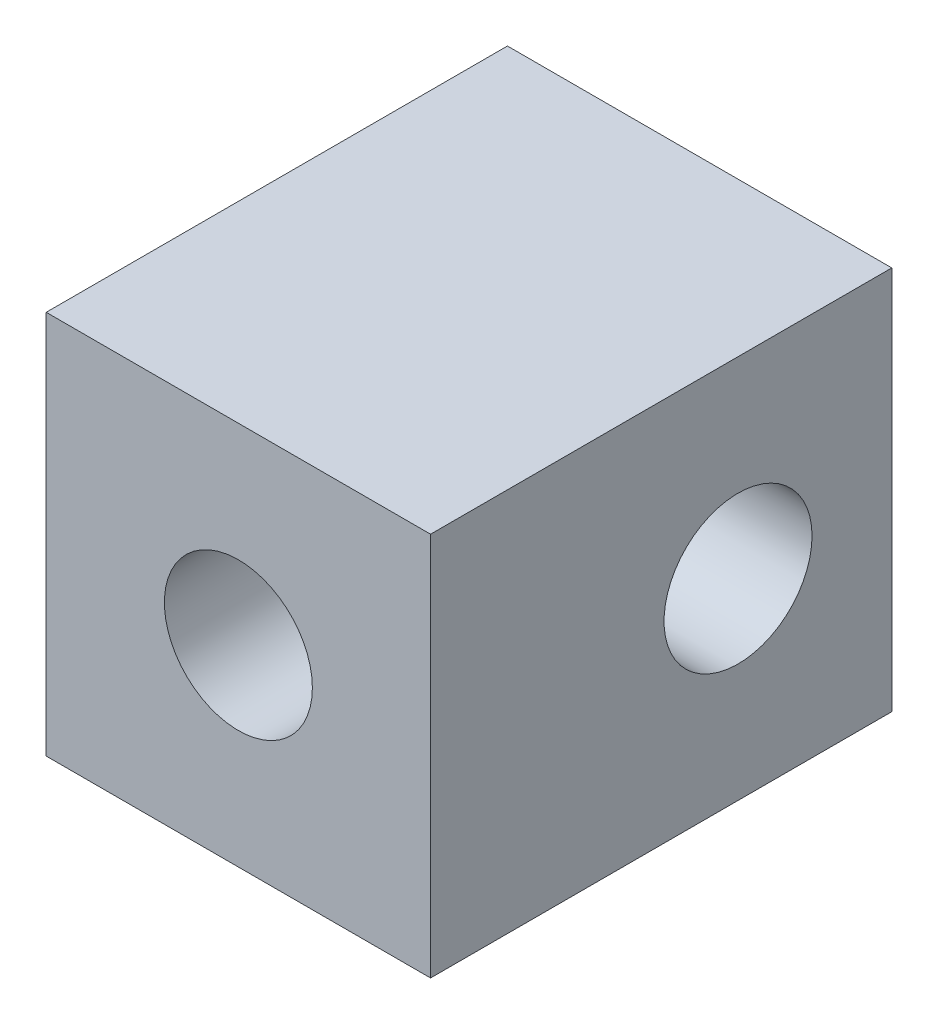
ISO-10303-21;
HEADER;
FILE_DESCRIPTION(('STEP AP214'),'2;1');
FILE_NAME('part.step','',(''),(''),'','','');
FILE_SCHEMA(('AUTOMOTIVE_DESIGN { 1 0 10303 214 1 1 1 1 }'));
ENDSEC;
DATA;
#1=APPLICATION_CONTEXT('core data for automotive mechanical design processes');
#2=APPLICATION_PROTOCOL_DEFINITION('international standard','automotive_design',2000,#1);
#3=PRODUCT_CONTEXT('',#1,'mechanical');
#4=PRODUCT('Part','Part','',(#3));
#5=PRODUCT_RELATED_PRODUCT_CATEGORY('part','',(#4));
#6=PRODUCT_DEFINITION_FORMATION('','',#4);
#7=PRODUCT_DEFINITION_CONTEXT('part definition',#1,'design');
#8=PRODUCT_DEFINITION('design','',#6,#7);
#9=PRODUCT_DEFINITION_SHAPE('','',#8);
#10=(LENGTH_UNIT() NAMED_UNIT(*) SI_UNIT(.MILLI.,.METRE.));
#11=(NAMED_UNIT(*) PLANE_ANGLE_UNIT() SI_UNIT($,.RADIAN.));
#12=(NAMED_UNIT(*) SI_UNIT($,.STERADIAN.) SOLID_ANGLE_UNIT());
#13=UNCERTAINTY_MEASURE_WITH_UNIT(LENGTH_MEASURE(1.E-05),#10,'distance_accuracy_value','');
#14=(GEOMETRIC_REPRESENTATION_CONTEXT(3) GLOBAL_UNCERTAINTY_ASSIGNED_CONTEXT((#13)) GLOBAL_UNIT_ASSIGNED_CONTEXT((#10,
#11,#12)) REPRESENTATION_CONTEXT('',''));
#15=CARTESIAN_POINT('',(0.,0.,0.));
#16=DIRECTION('',(0.,0.,1.));
#17=DIRECTION('',(1.,0.,0.));
#18=AXIS2_PLACEMENT_3D('',#15,#16,#17);
#19=CARTESIAN_POINT('',(-13.1570418477105,10.,-46.6498333059344));
#20=DIRECTION('',(-1.,0.,0.));
#21=DIRECTION('',(0.,0.,1.));
#22=AXIS2_PLACEMENT_3D('',#19,#20,#21);
#23=PLANE('',#22);
#24=CARTESIAN_POINT('',(-13.1570418477105,5.,-42.6498333059344));
#25=DIRECTION('',(1.,0.,0.));
#26=DIRECTION('',(0.,0.,-1.));
#27=AXIS2_PLACEMENT_3D('',#24,#25,#26);
#28=CIRCLE('',#27,1.925);
#29=CARTESIAN_POINT('',(-13.1570418477105,5.,-44.5748333059344));
#30=VERTEX_POINT('',#29);
#31=EDGE_CURVE('E116',#30,#30,#28,.T.);
#32=ORIENTED_EDGE('',*,*,#31,.F.);
#33=EDGE_LOOP('',(#32));
#34=FACE_BOUND('',#33,.T.);
#35=DIRECTION('',(0.,0.,-1.));
#36=VECTOR('',#35,1.);
#37=CARTESIAN_POINT('',(-13.1570418477105,0.,-46.6498333059344));
#38=LINE('',#37,#36);
#39=CARTESIAN_POINT('',(-13.1570418477105,0.,-34.6498333059344));
#40=VERTEX_POINT('',#39);
#41=CARTESIAN_POINT('',(-13.1570418477105,0.,-46.6498333059344));
#42=VERTEX_POINT('',#41);
#43=EDGE_CURVE('E96',#40,#42,#38,.T.);
#44=ORIENTED_EDGE('',*,*,#43,.T.);
#45=DIRECTION('',(0.,-1.,0.));
#46=VECTOR('',#45,1.);
#47=CARTESIAN_POINT('',(-13.1570418477105,10.,-46.6498333059344));
#48=LINE('',#47,#46);
#49=CARTESIAN_POINT('',(-13.1570418477105,10.,-46.6498333059344));
#50=VERTEX_POINT('',#49);
#51=EDGE_CURVE('E11',#50,#42,#48,.T.);
#52=ORIENTED_EDGE('',*,*,#51,.F.);
#53=DIRECTION('',(0.,0.,-1.));
#54=VECTOR('',#53,1.);
#55=CARTESIAN_POINT('',(-13.1570418477105,10.,-46.6498333059344));
#56=LINE('',#55,#54);
#57=CARTESIAN_POINT('',(-13.1570418477105,10.,-34.6498333059344));
#58=VERTEX_POINT('',#57);
#59=EDGE_CURVE('E84',#58,#50,#56,.T.);
#60=ORIENTED_EDGE('',*,*,#59,.F.);
#61=DIRECTION('',(0.,-1.,0.));
#62=VECTOR('',#61,1.);
#63=CARTESIAN_POINT('',(-13.1570418477105,10.,-34.6498333059344));
#64=LINE('',#63,#62);
#65=EDGE_CURVE('E92',#58,#40,#64,.T.);
#66=ORIENTED_EDGE('',*,*,#65,.T.);
#67=EDGE_LOOP('',(#44,#52,#60,#66));
#68=FACE_BOUND('',#67,.T.);
#69=ADVANCED_FACE('F33',(#34,#68),#23,.F.);
#70=CARTESIAN_POINT('',(-23.1570418477105,10.,-46.6498333059344));
#71=DIRECTION('',(0.,0.,1.));
#72=DIRECTION('',(1.,0.,0.));
#73=AXIS2_PLACEMENT_3D('',#70,#71,#72);
#74=PLANE('',#73);
#75=DIRECTION('',(-1.,0.,0.));
#76=VECTOR('',#75,1.);
#77=CARTESIAN_POINT('',(-23.1570418477105,0.,-46.6498333059344));
#78=LINE('',#77,#76);
#79=CARTESIAN_POINT('',(-23.1570418477105,0.,-46.6498333059344));
#80=VERTEX_POINT('',#79);
#81=EDGE_CURVE('E88',#42,#80,#78,.T.);
#82=ORIENTED_EDGE('',*,*,#81,.T.);
#83=DIRECTION('',(0.,-1.,0.));
#84=VECTOR('',#83,1.);
#85=CARTESIAN_POINT('',(-23.1570418477105,10.,-46.6498333059344));
#86=LINE('',#85,#84);
#87=CARTESIAN_POINT('',(-23.1570418477105,10.,-46.6498333059344));
#88=VERTEX_POINT('',#87);
#89=EDGE_CURVE('E41',#88,#80,#86,.T.);
#90=ORIENTED_EDGE('',*,*,#89,.F.);
#91=DIRECTION('',(-1.,0.,0.));
#92=VECTOR('',#91,1.);
#93=CARTESIAN_POINT('',(-23.1570418477105,10.,-46.6498333059344));
#94=LINE('',#93,#92);
#95=EDGE_CURVE('E79',#50,#88,#94,.T.);
#96=ORIENTED_EDGE('',*,*,#95,.F.);
#97=ORIENTED_EDGE('',*,*,#51,.T.);
#98=EDGE_LOOP('',(#82,#90,#96,#97));
#99=FACE_BOUND('',#98,.T.);
#100=ADVANCED_FACE('F87',(#99),#74,.F.);
#101=CARTESIAN_POINT('',(-23.1570418477105,10.,-46.6498333059344));
#102=DIRECTION('',(1.,0.,0.));
#103=DIRECTION('',(0.,0.,-1.));
#104=AXIS2_PLACEMENT_3D('',#101,#102,#103);
#105=PLANE('',#104);
#106=CARTESIAN_POINT('',(-23.1570418477105,5.,-42.6498333059344));
#107=DIRECTION('',(1.,0.,0.));
#108=DIRECTION('',(0.,0.,-1.));
#109=AXIS2_PLACEMENT_3D('',#106,#107,#108);
#110=CIRCLE('',#109,1.925);
#111=CARTESIAN_POINT('',(-23.1570418477105,5.,-44.5748333059344));
#112=VERTEX_POINT('',#111);
#113=EDGE_CURVE('E113',#112,#112,#110,.T.);
#114=ORIENTED_EDGE('',*,*,#113,.T.);
#115=EDGE_LOOP('',(#114));
#116=FACE_BOUND('',#115,.T.);
#117=DIRECTION('',(0.,0.,1.));
#118=VECTOR('',#117,1.);
#119=CARTESIAN_POINT('',(-23.1570418477105,0.,-46.6498333059344));
#120=LINE('',#119,#118);
#121=CARTESIAN_POINT('',(-23.1570418477105,0.,-34.6498333059344));
#122=VERTEX_POINT('',#121);
#123=EDGE_CURVE('E66',#80,#122,#120,.T.);
#124=ORIENTED_EDGE('',*,*,#123,.T.);
#125=DIRECTION('',(0.,-1.,0.));
#126=VECTOR('',#125,1.);
#127=CARTESIAN_POINT('',(-23.1570418477105,10.,-34.6498333059344));
#128=LINE('',#127,#126);
#129=CARTESIAN_POINT('',(-23.1570418477105,10.,-34.6498333059344));
#130=VERTEX_POINT('',#129);
#131=EDGE_CURVE('E89',#130,#122,#128,.T.);
#132=ORIENTED_EDGE('',*,*,#131,.F.);
#133=DIRECTION('',(0.,0.,1.));
#134=VECTOR('',#133,1.);
#135=CARTESIAN_POINT('',(-23.1570418477105,10.,-46.6498333059344));
#136=LINE('',#135,#134);
#137=EDGE_CURVE('E82',#88,#130,#136,.T.);
#138=ORIENTED_EDGE('',*,*,#137,.F.);
#139=ORIENTED_EDGE('',*,*,#89,.T.);
#140=EDGE_LOOP('',(#124,#132,#138,#139));
#141=FACE_BOUND('',#140,.T.);
#142=ADVANCED_FACE('F90',(#116,#141),#105,.F.);
#143=CARTESIAN_POINT('',(-23.1570418477105,10.,-34.6498333059344));
#144=DIRECTION('',(0.,0.,-1.));
#145=DIRECTION('',(-1.,0.,0.));
#146=AXIS2_PLACEMENT_3D('',#143,#144,#145);
#147=PLANE('',#146);
#148=CARTESIAN_POINT('',(-18.1570418477105,5.,-34.6498333059344));
#149=DIRECTION('',(0.,0.,1.));
#150=DIRECTION('',(1.,0.,0.));
#151=AXIS2_PLACEMENT_3D('',#148,#149,#150);
#152=CIRCLE('',#151,1.925);
#153=CARTESIAN_POINT('',(-16.2320418477105,5.,-34.6498333059344));
#154=VERTEX_POINT('',#153);
#155=EDGE_CURVE('E110',#154,#154,#152,.T.);
#156=ORIENTED_EDGE('',*,*,#155,.F.);
#157=EDGE_LOOP('',(#156));
#158=FACE_BOUND('',#157,.T.);
#159=DIRECTION('',(1.,0.,0.));
#160=VECTOR('',#159,1.);
#161=CARTESIAN_POINT('',(-23.1570418477105,0.,-34.6498333059344));
#162=LINE('',#161,#160);
#163=EDGE_CURVE('E72',#122,#40,#162,.T.);
#164=ORIENTED_EDGE('',*,*,#163,.T.);
#165=ORIENTED_EDGE('',*,*,#65,.F.);
#166=DIRECTION('',(1.,0.,0.));
#167=VECTOR('',#166,1.);
#168=CARTESIAN_POINT('',(-23.1570418477105,10.,-34.6498333059344));
#169=LINE('',#168,#167);
#170=EDGE_CURVE('E49',#130,#58,#169,.T.);
#171=ORIENTED_EDGE('',*,*,#170,.F.);
#172=ORIENTED_EDGE('',*,*,#131,.T.);
#173=EDGE_LOOP('',(#164,#165,#171,#172));
#174=FACE_BOUND('',#173,.T.);
#175=ADVANCED_FACE('F104',(#158,#174),#147,.F.);
#176=CARTESIAN_POINT('',(0.,10.,0.));
#177=DIRECTION('',(0.,1.,0.));
#178=DIRECTION('',(0.,0.,1.));
#179=AXIS2_PLACEMENT_3D('',#176,#177,#178);
#180=PLANE('',#179);
#181=ORIENTED_EDGE('',*,*,#59,.T.);
#182=ORIENTED_EDGE('',*,*,#95,.T.);
#183=ORIENTED_EDGE('',*,*,#137,.T.);
#184=ORIENTED_EDGE('',*,*,#170,.T.);
#185=EDGE_LOOP('',(#181,#182,#183,#184));
#186=FACE_BOUND('',#185,.T.);
#187=ADVANCED_FACE('F80',(#186),#180,.T.);
#188=CARTESIAN_POINT('',(0.,0.,0.));
#189=DIRECTION('',(0.,1.,0.));
#190=DIRECTION('',(0.,0.,1.));
#191=AXIS2_PLACEMENT_3D('',#188,#189,#190);
#192=PLANE('',#191);
#193=ORIENTED_EDGE('',*,*,#43,.F.);
#194=ORIENTED_EDGE('',*,*,#163,.F.);
#195=ORIENTED_EDGE('',*,*,#123,.F.);
#196=ORIENTED_EDGE('',*,*,#81,.F.);
#197=EDGE_LOOP('',(#193,#194,#195,#196));
#198=FACE_BOUND('',#197,.T.);
#199=ADVANCED_FACE('F107',(#198),#192,.F.);
#200=CARTESIAN_POINT('',(-18.1570418477105,5.,-39.1498333059344));
#201=DIRECTION('',(0.,0.,1.));
#202=DIRECTION('',(1.,0.,0.));
#203=AXIS2_PLACEMENT_3D('',#200,#201,#202);
#204=CYLINDRICAL_SURFACE('',#203,1.925);
#205=CARTESIAN_POINT('',(-18.1570418477105,5.,-39.1498333059344));
#206=DIRECTION('',(0.,0.,1.));
#207=DIRECTION('',(1.,0.,0.));
#208=AXIS2_PLACEMENT_3D('',#205,#206,#207);
#209=CIRCLE('',#208,1.925);
#210=CARTESIAN_POINT('',(-16.2320418477105,5.,-39.1498333059344));
#211=VERTEX_POINT('',#210);
#212=EDGE_CURVE('E99',#211,#211,#209,.T.);
#213=ORIENTED_EDGE('',*,*,#212,.F.);
#214=EDGE_LOOP('',(#213));
#215=FACE_BOUND('',#214,.T.);
#216=ORIENTED_EDGE('',*,*,#155,.T.);
#217=EDGE_LOOP('',(#216));
#218=FACE_BOUND('',#217,.T.);
#219=ADVANCED_FACE('F144',(#215,#218),#204,.F.);
#220=CARTESIAN_POINT('',(0.,0.,-39.1498333059344));
#221=DIRECTION('',(0.,0.,1.));
#222=DIRECTION('',(1.,0.,0.));
#223=AXIS2_PLACEMENT_3D('',#220,#221,#222);
#224=PLANE('',#223);
#225=ORIENTED_EDGE('',*,*,#212,.T.);
#226=EDGE_LOOP('',(#225));
#227=FACE_BOUND('',#226,.T.);
#228=ADVANCED_FACE('F126',(#227),#224,.T.);
#229=CARTESIAN_POINT('',(-23.1570418477105,5.,-42.6498333059344));
#230=DIRECTION('',(1.,0.,0.));
#231=DIRECTION('',(0.,0.,-1.));
#232=AXIS2_PLACEMENT_3D('',#229,#230,#231);
#233=CYLINDRICAL_SURFACE('',#232,1.925);
#234=ORIENTED_EDGE('',*,*,#113,.F.);
#235=EDGE_LOOP('',(#234));
#236=FACE_BOUND('',#235,.T.);
#237=ORIENTED_EDGE('',*,*,#31,.T.);
#238=EDGE_LOOP('',(#237));
#239=FACE_BOUND('',#238,.T.);
#240=ADVANCED_FACE('F123',(#236,#239),#233,.F.);
#241=CLOSED_SHELL('',(#69,#100,#142,#175,#187,#199,#219,#228,#240));
#242=MANIFOLD_SOLID_BREP('B2',#241);
#243=ADVANCED_BREP_SHAPE_REPRESENTATION('',(#18,#242),#14);
#244=SHAPE_DEFINITION_REPRESENTATION(#9,#243);
ENDSEC;
END-ISO-10303-21;
